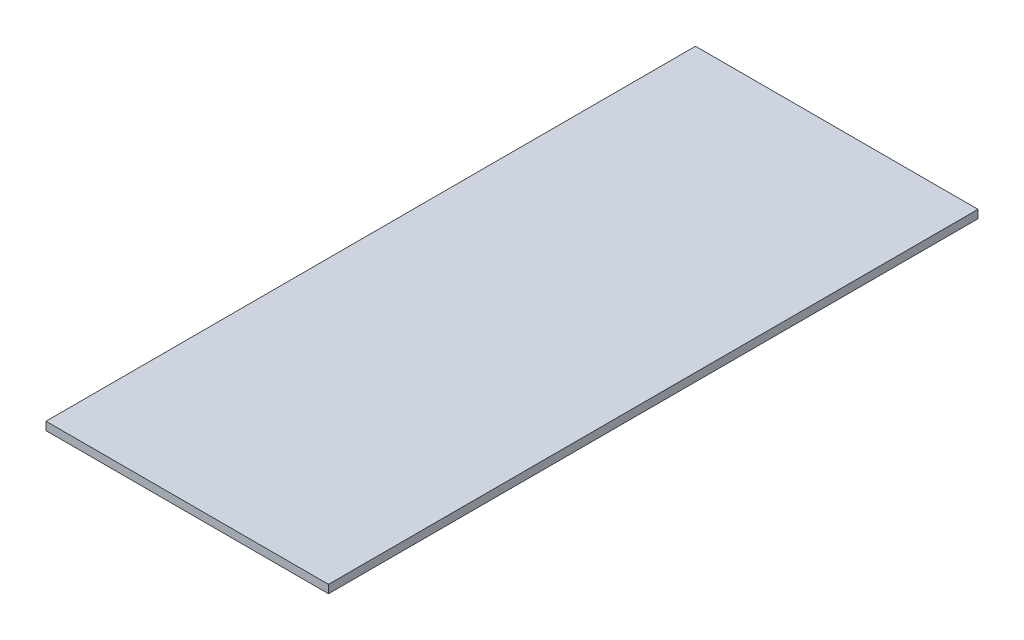
ISO-10303-21;
HEADER;
FILE_DESCRIPTION(('STEP AP214'),'2;1');
FILE_NAME('part.step','',(''),(''),'','','');
FILE_SCHEMA(('AUTOMOTIVE_DESIGN { 1 0 10303 214 1 1 1 1 }'));
ENDSEC;
DATA;
#1=APPLICATION_CONTEXT('core data for automotive mechanical design processes');
#2=APPLICATION_PROTOCOL_DEFINITION('international standard','automotive_design',2000,#1);
#3=PRODUCT_CONTEXT('',#1,'mechanical');
#4=PRODUCT('Part','Part','',(#3));
#5=PRODUCT_RELATED_PRODUCT_CATEGORY('part','',(#4));
#6=PRODUCT_DEFINITION_FORMATION('','',#4);
#7=PRODUCT_DEFINITION_CONTEXT('part definition',#1,'design');
#8=PRODUCT_DEFINITION('design','',#6,#7);
#9=PRODUCT_DEFINITION_SHAPE('','',#8);
#10=(LENGTH_UNIT() NAMED_UNIT(*) SI_UNIT(.MILLI.,.METRE.));
#11=(NAMED_UNIT(*) PLANE_ANGLE_UNIT() SI_UNIT($,.RADIAN.));
#12=(NAMED_UNIT(*) SI_UNIT($,.STERADIAN.) SOLID_ANGLE_UNIT());
#13=UNCERTAINTY_MEASURE_WITH_UNIT(LENGTH_MEASURE(1.E-05),#10,'distance_accuracy_value','');
#14=(GEOMETRIC_REPRESENTATION_CONTEXT(3) GLOBAL_UNCERTAINTY_ASSIGNED_CONTEXT((#13)) GLOBAL_UNIT_ASSIGNED_CONTEXT((#10,
#11,#12)) REPRESENTATION_CONTEXT('',''));
#15=CARTESIAN_POINT('',(0.,0.,0.));
#16=DIRECTION('',(0.,0.,1.));
#17=DIRECTION('',(1.,0.,0.));
#18=AXIS2_PLACEMENT_3D('',#15,#16,#17);
#19=CARTESIAN_POINT('',(-13.81,0.8,-31.75));
#20=DIRECTION('',(1.,0.,0.));
#21=DIRECTION('',(0.,0.,-1.));
#22=AXIS2_PLACEMENT_3D('',#19,#20,#21);
#23=PLANE('',#22);
#24=DIRECTION('',(0.,0.,1.));
#25=VECTOR('',#24,1.);
#26=CARTESIAN_POINT('',(-13.81,0.,-31.75));
#27=LINE('',#26,#25);
#28=CARTESIAN_POINT('',(-13.81,0.,-31.75));
#29=VERTEX_POINT('',#28);
#30=CARTESIAN_POINT('',(-13.81,0.,31.75));
#31=VERTEX_POINT('',#30);
#32=EDGE_CURVE('E109',#29,#31,#27,.T.);
#33=ORIENTED_EDGE('',*,*,#32,.T.);
#34=DIRECTION('',(0.,-1.,0.));
#35=VECTOR('',#34,1.);
#36=CARTESIAN_POINT('',(-13.81,0.8,31.75));
#37=LINE('',#36,#35);
#38=CARTESIAN_POINT('',(-13.81,0.8,31.75));
#39=VERTEX_POINT('',#38);
#40=EDGE_CURVE('E11',#39,#31,#37,.T.);
#41=ORIENTED_EDGE('',*,*,#40,.F.);
#42=DIRECTION('',(0.,0.,1.));
#43=VECTOR('',#42,1.);
#44=CARTESIAN_POINT('',(-13.81,0.8,-31.75));
#45=LINE('',#44,#43);
#46=CARTESIAN_POINT('',(-13.81,0.8,-31.75));
#47=VERTEX_POINT('',#46);
#48=EDGE_CURVE('E92',#47,#39,#45,.T.);
#49=ORIENTED_EDGE('',*,*,#48,.F.);
#50=DIRECTION('',(0.,-1.,0.));
#51=VECTOR('',#50,1.);
#52=CARTESIAN_POINT('',(-13.81,0.8,-31.75));
#53=LINE('',#52,#51);
#54=EDGE_CURVE('E105',#47,#29,#53,.T.);
#55=ORIENTED_EDGE('',*,*,#54,.T.);
#56=EDGE_LOOP('',(#33,#41,#49,#55));
#57=FACE_BOUND('',#56,.T.);
#58=ADVANCED_FACE('F40',(#57),#23,.F.);
#59=CARTESIAN_POINT('',(-13.81,0.8,31.75));
#60=DIRECTION('',(0.,0.,-1.));
#61=DIRECTION('',(-1.,0.,0.));
#62=AXIS2_PLACEMENT_3D('',#59,#60,#61);
#63=PLANE('',#62);
#64=DIRECTION('',(1.,0.,0.));
#65=VECTOR('',#64,1.);
#66=CARTESIAN_POINT('',(-13.81,0.,31.75));
#67=LINE('',#66,#65);
#68=CARTESIAN_POINT('',(13.81,0.,31.75));
#69=VERTEX_POINT('',#68);
#70=EDGE_CURVE('E97',#31,#69,#67,.T.);
#71=ORIENTED_EDGE('',*,*,#70,.T.);
#72=DIRECTION('',(0.,-1.,0.));
#73=VECTOR('',#72,1.);
#74=CARTESIAN_POINT('',(13.81,0.8,31.75));
#75=LINE('',#74,#73);
#76=CARTESIAN_POINT('',(13.81,0.8,31.75));
#77=VERTEX_POINT('',#76);
#78=EDGE_CURVE('E49',#77,#69,#75,.T.);
#79=ORIENTED_EDGE('',*,*,#78,.F.);
#80=DIRECTION('',(1.,0.,0.));
#81=VECTOR('',#80,1.);
#82=CARTESIAN_POINT('',(-13.81,0.8,31.75));
#83=LINE('',#82,#81);
#84=EDGE_CURVE('E87',#39,#77,#83,.T.);
#85=ORIENTED_EDGE('',*,*,#84,.F.);
#86=ORIENTED_EDGE('',*,*,#40,.T.);
#87=EDGE_LOOP('',(#71,#79,#85,#86));
#88=FACE_BOUND('',#87,.T.);
#89=ADVANCED_FACE('F96',(#88),#63,.F.);
#90=CARTESIAN_POINT('',(13.81,0.8,-31.75));
#91=DIRECTION('',(-1.,0.,0.));
#92=DIRECTION('',(0.,0.,1.));
#93=AXIS2_PLACEMENT_3D('',#90,#91,#92);
#94=PLANE('',#93);
#95=DIRECTION('',(0.,0.,-1.));
#96=VECTOR('',#95,1.);
#97=CARTESIAN_POINT('',(13.81,0.,-31.75));
#98=LINE('',#97,#96);
#99=CARTESIAN_POINT('',(13.81,0.,-31.75));
#100=VERTEX_POINT('',#99);
#101=EDGE_CURVE('E74',#69,#100,#98,.T.);
#102=ORIENTED_EDGE('',*,*,#101,.T.);
#103=DIRECTION('',(0.,-1.,0.));
#104=VECTOR('',#103,1.);
#105=CARTESIAN_POINT('',(13.81,0.8,-31.75));
#106=LINE('',#105,#104);
#107=CARTESIAN_POINT('',(13.81,0.8,-31.75));
#108=VERTEX_POINT('',#107);
#109=EDGE_CURVE('E99',#108,#100,#106,.T.);
#110=ORIENTED_EDGE('',*,*,#109,.F.);
#111=DIRECTION('',(0.,0.,-1.));
#112=VECTOR('',#111,1.);
#113=CARTESIAN_POINT('',(13.81,0.8,-31.75));
#114=LINE('',#113,#112);
#115=EDGE_CURVE('E90',#77,#108,#114,.T.);
#116=ORIENTED_EDGE('',*,*,#115,.F.);
#117=ORIENTED_EDGE('',*,*,#78,.T.);
#118=EDGE_LOOP('',(#102,#110,#116,#117));
#119=FACE_BOUND('',#118,.T.);
#120=ADVANCED_FACE('F100',(#119),#94,.F.);
#121=CARTESIAN_POINT('',(-13.81,0.8,-31.75));
#122=DIRECTION('',(0.,0.,1.));
#123=DIRECTION('',(1.,0.,0.));
#124=AXIS2_PLACEMENT_3D('',#121,#122,#123);
#125=PLANE('',#124);
#126=DIRECTION('',(-1.,0.,0.));
#127=VECTOR('',#126,1.);
#128=CARTESIAN_POINT('',(-13.81,0.,-31.75));
#129=LINE('',#128,#127);
#130=EDGE_CURVE('E80',#100,#29,#129,.T.);
#131=ORIENTED_EDGE('',*,*,#130,.T.);
#132=ORIENTED_EDGE('',*,*,#54,.F.);
#133=DIRECTION('',(-1.,0.,0.));
#134=VECTOR('',#133,1.);
#135=CARTESIAN_POINT('',(-13.81,0.8,-31.75));
#136=LINE('',#135,#134);
#137=EDGE_CURVE('E57',#108,#47,#136,.T.);
#138=ORIENTED_EDGE('',*,*,#137,.F.);
#139=ORIENTED_EDGE('',*,*,#109,.T.);
#140=EDGE_LOOP('',(#131,#132,#138,#139));
#141=FACE_BOUND('',#140,.T.);
#142=ADVANCED_FACE('F122',(#141),#125,.F.);
#143=CARTESIAN_POINT('',(0.,0.8,0.));
#144=DIRECTION('',(0.,1.,0.));
#145=DIRECTION('',(0.,0.,1.));
#146=AXIS2_PLACEMENT_3D('',#143,#144,#145);
#147=PLANE('',#146);
#148=ORIENTED_EDGE('',*,*,#48,.T.);
#149=ORIENTED_EDGE('',*,*,#84,.T.);
#150=ORIENTED_EDGE('',*,*,#115,.T.);
#151=ORIENTED_EDGE('',*,*,#137,.T.);
#152=EDGE_LOOP('',(#148,#149,#150,#151));
#153=FACE_BOUND('',#152,.T.);
#154=ADVANCED_FACE('F88',(#153),#147,.T.);
#155=CARTESIAN_POINT('',(0.,0.,0.));
#156=DIRECTION('',(0.,1.,0.));
#157=DIRECTION('',(0.,0.,1.));
#158=AXIS2_PLACEMENT_3D('',#155,#156,#157);
#159=PLANE('',#158);
#160=ORIENTED_EDGE('',*,*,#32,.F.);
#161=ORIENTED_EDGE('',*,*,#130,.F.);
#162=ORIENTED_EDGE('',*,*,#101,.F.);
#163=ORIENTED_EDGE('',*,*,#70,.F.);
#164=EDGE_LOOP('',(#160,#161,#162,#163));
#165=FACE_BOUND('',#164,.T.);
#166=ADVANCED_FACE('F125',(#165),#159,.F.);
#167=CLOSED_SHELL('',(#58,#89,#120,#142,#154,#166));
#168=MANIFOLD_SOLID_BREP('B2',#167);
#169=ADVANCED_BREP_SHAPE_REPRESENTATION('',(#18,#168),#14);
#170=SHAPE_DEFINITION_REPRESENTATION(#9,#169);
ENDSEC;
END-ISO-10303-21;
